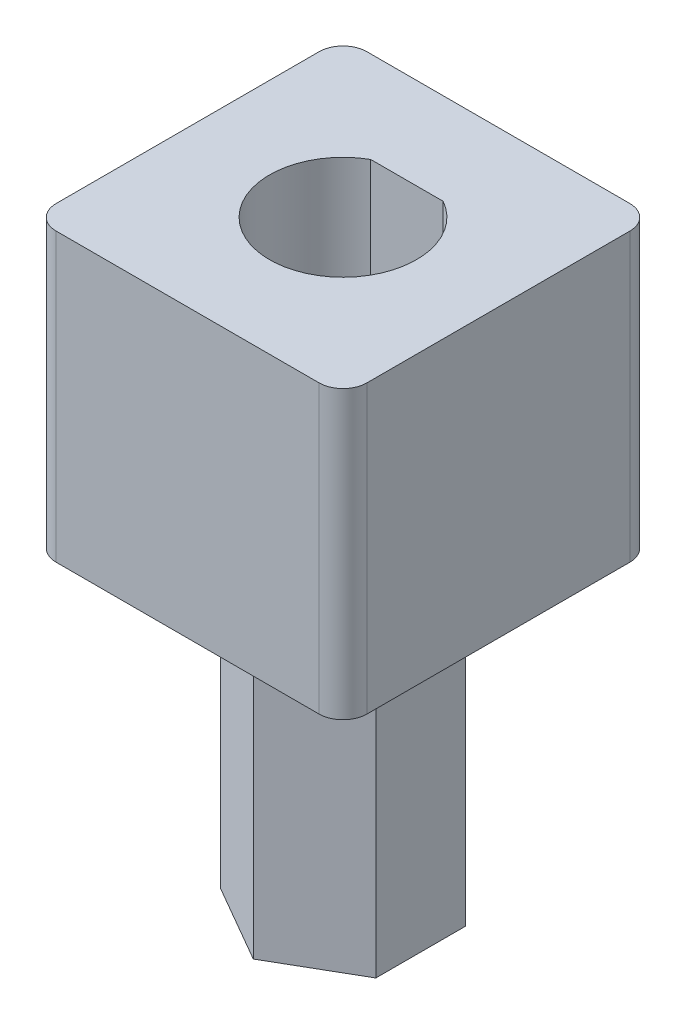
ISO-10303-21;
HEADER;
FILE_DESCRIPTION(('STEP AP214'),'2;1');
FILE_NAME('part.step','',(''),(''),'','','');
FILE_SCHEMA(('AUTOMOTIVE_DESIGN { 1 0 10303 214 1 1 1 1 }'));
ENDSEC;
DATA;
#1=APPLICATION_CONTEXT('core data for automotive mechanical design processes');
#2=APPLICATION_PROTOCOL_DEFINITION('international standard','automotive_design',2000,#1);
#3=PRODUCT_CONTEXT('',#1,'mechanical');
#4=PRODUCT('Part','Part','',(#3));
#5=PRODUCT_RELATED_PRODUCT_CATEGORY('part','',(#4));
#6=PRODUCT_DEFINITION_FORMATION('','',#4);
#7=PRODUCT_DEFINITION_CONTEXT('part definition',#1,'design');
#8=PRODUCT_DEFINITION('design','',#6,#7);
#9=PRODUCT_DEFINITION_SHAPE('','',#8);
#10=(LENGTH_UNIT() NAMED_UNIT(*) SI_UNIT(.MILLI.,.METRE.));
#11=(NAMED_UNIT(*) PLANE_ANGLE_UNIT() SI_UNIT($,.RADIAN.));
#12=(NAMED_UNIT(*) SI_UNIT($,.STERADIAN.) SOLID_ANGLE_UNIT());
#13=UNCERTAINTY_MEASURE_WITH_UNIT(LENGTH_MEASURE(1.E-05),#10,'distance_accuracy_value','');
#14=(GEOMETRIC_REPRESENTATION_CONTEXT(3) GLOBAL_UNCERTAINTY_ASSIGNED_CONTEXT((#13)) GLOBAL_UNIT_ASSIGNED_CONTEXT((#10,
#11,#12)) REPRESENTATION_CONTEXT('',''));
#15=CARTESIAN_POINT('',(0.,0.,0.));
#16=DIRECTION('',(0.,0.,1.));
#17=DIRECTION('',(1.,0.,0.));
#18=AXIS2_PLACEMENT_3D('',#15,#16,#17);
#19=CARTESIAN_POINT('',(0.,13.,0.));
#20=DIRECTION('',(0.,1.,0.));
#21=DIRECTION('',(0.,0.,1.));
#22=AXIS2_PLACEMENT_3D('',#19,#20,#21);
#23=PLANE('',#22);
#24=DIRECTION('',(-1.,0.,0.));
#25=VECTOR('',#24,1.);
#26=CARTESIAN_POINT('',(-1.51657508881031,13.,-2.675));
#27=LINE('',#26,#25);
#28=CARTESIAN_POINT('',(1.51657508881031,13.,-2.675));
#29=VERTEX_POINT('',#28);
#30=CARTESIAN_POINT('',(-1.51657508881031,13.,-2.675));
#31=VERTEX_POINT('',#30);
#32=EDGE_CURVE('E227',#29,#31,#27,.T.);
#33=ORIENTED_EDGE('',*,*,#32,.T.);
#34=CARTESIAN_POINT('',(0.,13.,0.));
#35=DIRECTION('',(0.,1.,0.));
#36=DIRECTION('',(0.,0.,1.));
#37=AXIS2_PLACEMENT_3D('',#34,#35,#36);
#38=CIRCLE('',#37,3.075);
#39=EDGE_CURVE('E315',#29,#31,#38,.F.);
#40=ORIENTED_EDGE('',*,*,#39,.F.);
#41=EDGE_LOOP('',(#33,#40));
#42=FACE_BOUND('',#41,.T.);
#43=ADVANCED_FACE('F41',(#42),#23,.T.);
#44=CARTESIAN_POINT('',(0.,13.,0.));
#45=DIRECTION('',(0.,1.,0.));
#46=DIRECTION('',(0.,0.,1.));
#47=AXIS2_PLACEMENT_3D('',#44,#45,#46);
#48=PLANE('',#47);
#49=CARTESIAN_POINT('',(0.,13.,0.));
#50=DIRECTION('',(0.,1.,0.));
#51=DIRECTION('',(0.,0.,1.));
#52=AXIS2_PLACEMENT_3D('',#49,#50,#51);
#53=CIRCLE('',#52,6.25277674973265);
#54=CARTESIAN_POINT('',(0.,13.,6.25277674973272));
#55=VERTEX_POINT('',#54);
#56=EDGE_CURVE('E11',#55,#55,#53,.F.);
#57=ORIENTED_EDGE('',*,*,#56,.F.);
#58=EDGE_LOOP('',(#57));
#59=FACE_BOUND('',#58,.T.);
#60=DIRECTION('',(-1.,0.,0.));
#61=VECTOR('',#60,1.);
#62=CARTESIAN_POINT('',(-6.5,13.,-6.5));
#63=LINE('',#62,#61);
#64=CARTESIAN_POINT('',(5.5,13.,-6.5));
#65=VERTEX_POINT('',#64);
#66=CARTESIAN_POINT('',(-5.5,13.,-6.5));
#67=VERTEX_POINT('',#66);
#68=EDGE_CURVE('E251',#65,#67,#63,.T.);
#69=ORIENTED_EDGE('',*,*,#68,.F.);
#70=CARTESIAN_POINT('',(5.5,13.,-5.5));
#71=DIRECTION('',(0.,1.,0.));
#72=DIRECTION('',(0.,0.,1.));
#73=AXIS2_PLACEMENT_3D('',#70,#71,#72);
#74=CIRCLE('',#73,1.);
#75=CARTESIAN_POINT('',(6.5,13.,-5.5));
#76=VERTEX_POINT('',#75);
#77=EDGE_CURVE('E335',#65,#76,#74,.F.);
#78=ORIENTED_EDGE('',*,*,#77,.T.);
#79=DIRECTION('',(0.,0.,-1.));
#80=VECTOR('',#79,1.);
#81=CARTESIAN_POINT('',(6.5,13.,-6.5));
#82=LINE('',#81,#80);
#83=CARTESIAN_POINT('',(6.5,13.,5.5));
#84=VERTEX_POINT('',#83);
#85=EDGE_CURVE('E271',#84,#76,#82,.T.);
#86=ORIENTED_EDGE('',*,*,#85,.F.);
#87=CARTESIAN_POINT('',(5.5,13.,5.5));
#88=DIRECTION('',(0.,1.,0.));
#89=DIRECTION('',(0.,0.,1.));
#90=AXIS2_PLACEMENT_3D('',#87,#88,#89);
#91=CIRCLE('',#90,1.);
#92=CARTESIAN_POINT('',(5.5,13.,6.5));
#93=VERTEX_POINT('',#92);
#94=EDGE_CURVE('E329',#84,#93,#91,.F.);
#95=ORIENTED_EDGE('',*,*,#94,.T.);
#96=DIRECTION('',(1.,0.,0.));
#97=VECTOR('',#96,1.);
#98=CARTESIAN_POINT('',(-6.5,13.,6.5));
#99=LINE('',#98,#97);
#100=CARTESIAN_POINT('',(-5.5,13.,6.5));
#101=VERTEX_POINT('',#100);
#102=EDGE_CURVE('E267',#101,#93,#99,.T.);
#103=ORIENTED_EDGE('',*,*,#102,.F.);
#104=CARTESIAN_POINT('',(-5.5,13.,5.5));
#105=DIRECTION('',(0.,1.,0.));
#106=DIRECTION('',(0.,0.,1.));
#107=AXIS2_PLACEMENT_3D('',#104,#105,#106);
#108=CIRCLE('',#107,1.);
#109=CARTESIAN_POINT('',(-6.5,13.,5.5));
#110=VERTEX_POINT('',#109);
#111=EDGE_CURVE('E326',#101,#110,#108,.F.);
#112=ORIENTED_EDGE('',*,*,#111,.T.);
#113=DIRECTION('',(0.,0.,1.));
#114=VECTOR('',#113,1.);
#115=CARTESIAN_POINT('',(-6.5,13.,-6.5));
#116=LINE('',#115,#114);
#117=CARTESIAN_POINT('',(-6.5,13.,-5.5));
#118=VERTEX_POINT('',#117);
#119=EDGE_CURVE('E245',#118,#110,#116,.T.);
#120=ORIENTED_EDGE('',*,*,#119,.F.);
#121=CARTESIAN_POINT('',(-5.5,13.,-5.5));
#122=DIRECTION('',(0.,1.,0.));
#123=DIRECTION('',(0.,0.,1.));
#124=AXIS2_PLACEMENT_3D('',#121,#122,#123);
#125=CIRCLE('',#124,1.);
#126=EDGE_CURVE('E332',#118,#67,#125,.F.);
#127=ORIENTED_EDGE('',*,*,#126,.T.);
#128=EDGE_LOOP('',(#69,#78,#86,#95,#103,#112,#120,#127));
#129=FACE_BOUND('',#128,.T.);
#130=ADVANCED_FACE('F390',(#59,#129),#48,.F.);
#131=CARTESIAN_POINT('',(0.,25.,0.));
#132=DIRECTION('',(0.,1.,0.));
#133=DIRECTION('',(0.,0.,1.));
#134=AXIS2_PLACEMENT_3D('',#131,#132,#133);
#135=PLANE('',#134);
#136=DIRECTION('',(0.,0.,-1.));
#137=VECTOR('',#136,1.);
#138=CARTESIAN_POINT('',(6.5,25.,-6.5));
#139=LINE('',#138,#137);
#140=CARTESIAN_POINT('',(6.5,25.,5.5));
#141=VERTEX_POINT('',#140);
#142=CARTESIAN_POINT('',(6.5,25.,-5.5));
#143=VERTEX_POINT('',#142);
#144=EDGE_CURVE('E255',#141,#143,#139,.T.);
#145=ORIENTED_EDGE('',*,*,#144,.T.);
#146=CARTESIAN_POINT('',(5.5,25.,-5.5));
#147=DIRECTION('',(0.,1.,0.));
#148=DIRECTION('',(0.,0.,1.));
#149=AXIS2_PLACEMENT_3D('',#146,#147,#148);
#150=CIRCLE('',#149,1.);
#151=CARTESIAN_POINT('',(5.5,25.,-6.5));
#152=VERTEX_POINT('',#151);
#153=EDGE_CURVE('E354',#143,#152,#150,.T.);
#154=ORIENTED_EDGE('',*,*,#153,.T.);
#155=DIRECTION('',(-1.,0.,0.));
#156=VECTOR('',#155,1.);
#157=CARTESIAN_POINT('',(-6.5,25.,-6.5));
#158=LINE('',#157,#156);
#159=CARTESIAN_POINT('',(-5.5,25.,-6.5));
#160=VERTEX_POINT('',#159);
#161=EDGE_CURVE('E259',#152,#160,#158,.T.);
#162=ORIENTED_EDGE('',*,*,#161,.T.);
#163=CARTESIAN_POINT('',(-5.5,25.,-5.5));
#164=DIRECTION('',(0.,1.,0.));
#165=DIRECTION('',(0.,0.,1.));
#166=AXIS2_PLACEMENT_3D('',#163,#164,#165);
#167=CIRCLE('',#166,1.);
#168=CARTESIAN_POINT('',(-6.5,25.,-5.5));
#169=VERTEX_POINT('',#168);
#170=EDGE_CURVE('E351',#160,#169,#167,.T.);
#171=ORIENTED_EDGE('',*,*,#170,.T.);
#172=DIRECTION('',(0.,0.,1.));
#173=VECTOR('',#172,1.);
#174=CARTESIAN_POINT('',(-6.5,25.,-6.5));
#175=LINE('',#174,#173);
#176=CARTESIAN_POINT('',(-6.5,25.,5.5));
#177=VERTEX_POINT('',#176);
#178=EDGE_CURVE('E246',#169,#177,#175,.T.);
#179=ORIENTED_EDGE('',*,*,#178,.T.);
#180=CARTESIAN_POINT('',(-5.5,25.,5.5));
#181=DIRECTION('',(0.,1.,0.));
#182=DIRECTION('',(0.,0.,1.));
#183=AXIS2_PLACEMENT_3D('',#180,#181,#182);
#184=CIRCLE('',#183,1.);
#185=CARTESIAN_POINT('',(-5.5,25.,6.5));
#186=VERTEX_POINT('',#185);
#187=EDGE_CURVE('E345',#177,#186,#184,.T.);
#188=ORIENTED_EDGE('',*,*,#187,.T.);
#189=DIRECTION('',(1.,0.,0.));
#190=VECTOR('',#189,1.);
#191=CARTESIAN_POINT('',(-6.5,25.,6.5));
#192=LINE('',#191,#190);
#193=CARTESIAN_POINT('',(5.5,25.,6.5));
#194=VERTEX_POINT('',#193);
#195=EDGE_CURVE('E250',#186,#194,#192,.T.);
#196=ORIENTED_EDGE('',*,*,#195,.T.);
#197=CARTESIAN_POINT('',(5.5,25.,5.5));
#198=DIRECTION('',(0.,1.,0.));
#199=DIRECTION('',(0.,0.,1.));
#200=AXIS2_PLACEMENT_3D('',#197,#198,#199);
#201=CIRCLE('',#200,1.);
#202=EDGE_CURVE('E348',#194,#141,#201,.T.);
#203=ORIENTED_EDGE('',*,*,#202,.T.);
#204=EDGE_LOOP('',(#145,#154,#162,#171,#179,#188,#196,#203));
#205=FACE_BOUND('',#204,.T.);
#206=CARTESIAN_POINT('',(0.,25.,0.));
#207=DIRECTION('',(0.,1.,0.));
#208=DIRECTION('',(0.,0.,1.));
#209=AXIS2_PLACEMENT_3D('',#206,#207,#208);
#210=CIRCLE('',#209,3.075);
#211=CARTESIAN_POINT('',(-1.51657508881031,25.,-2.675));
#212=VERTEX_POINT('',#211);
#213=CARTESIAN_POINT('',(1.51657508881031,25.,-2.675));
#214=VERTEX_POINT('',#213);
#215=EDGE_CURVE('E232',#212,#214,#210,.T.);
#216=ORIENTED_EDGE('',*,*,#215,.F.);
#217=DIRECTION('',(1.,0.,0.));
#218=VECTOR('',#217,1.);
#219=CARTESIAN_POINT('',(-1.51657508881031,25.,-2.675));
#220=LINE('',#219,#218);
#221=EDGE_CURVE('E228',#212,#214,#220,.T.);
#222=ORIENTED_EDGE('',*,*,#221,.T.);
#223=EDGE_LOOP('',(#216,#222));
#224=FACE_BOUND('',#223,.T.);
#225=ADVANCED_FACE('F378',(#205,#224),#135,.T.);
#226=CARTESIAN_POINT('',(-6.5,25.,-6.5));
#227=DIRECTION('',(1.,0.,0.));
#228=DIRECTION('',(0.,0.,-1.));
#229=AXIS2_PLACEMENT_3D('',#226,#227,#228);
#230=PLANE('',#229);
#231=ORIENTED_EDGE('',*,*,#178,.F.);
#232=DIRECTION('',(0.,-1.,0.));
#233=VECTOR('',#232,1.);
#234=CARTESIAN_POINT('',(-6.5,25.,-5.5));
#235=LINE('',#234,#233);
#236=EDGE_CURVE('E360',#169,#118,#235,.T.);
#237=ORIENTED_EDGE('',*,*,#236,.T.);
#238=ORIENTED_EDGE('',*,*,#119,.T.);
#239=DIRECTION('',(0.,-1.,0.));
#240=VECTOR('',#239,1.);
#241=CARTESIAN_POINT('',(-6.5,25.,5.5));
#242=LINE('',#241,#240);
#243=EDGE_CURVE('E357',#110,#177,#242,.F.);
#244=ORIENTED_EDGE('',*,*,#243,.T.);
#245=EDGE_LOOP('',(#231,#237,#238,#244));
#246=FACE_BOUND('',#245,.T.);
#247=ADVANCED_FACE('F406',(#246),#230,.F.);
#248=CARTESIAN_POINT('',(-6.5,25.,6.5));
#249=DIRECTION('',(0.,0.,-1.));
#250=DIRECTION('',(-1.,0.,0.));
#251=AXIS2_PLACEMENT_3D('',#248,#249,#250);
#252=PLANE('',#251);
#253=ORIENTED_EDGE('',*,*,#102,.T.);
#254=DIRECTION('',(0.,-1.,0.));
#255=VECTOR('',#254,1.);
#256=CARTESIAN_POINT('',(5.5,25.,6.5));
#257=LINE('',#256,#255);
#258=EDGE_CURVE('E51',#93,#194,#257,.F.);
#259=ORIENTED_EDGE('',*,*,#258,.T.);
#260=ORIENTED_EDGE('',*,*,#195,.F.);
#261=DIRECTION('',(0.,-1.,0.));
#262=VECTOR('',#261,1.);
#263=CARTESIAN_POINT('',(-5.5,25.,6.5));
#264=LINE('',#263,#262);
#265=EDGE_CURVE('E364',#186,#101,#264,.T.);
#266=ORIENTED_EDGE('',*,*,#265,.T.);
#267=EDGE_LOOP('',(#253,#259,#260,#266));
#268=FACE_BOUND('',#267,.T.);
#269=ADVANCED_FACE('F372',(#268),#252,.F.);
#270=CARTESIAN_POINT('',(6.5,25.,-6.5));
#271=DIRECTION('',(-1.,0.,0.));
#272=DIRECTION('',(0.,0.,1.));
#273=AXIS2_PLACEMENT_3D('',#270,#271,#272);
#274=PLANE('',#273);
#275=ORIENTED_EDGE('',*,*,#85,.T.);
#276=DIRECTION('',(0.,-1.,0.));
#277=VECTOR('',#276,1.);
#278=CARTESIAN_POINT('',(6.5,25.,-5.5));
#279=LINE('',#278,#277);
#280=EDGE_CURVE('E342',#76,#143,#279,.F.);
#281=ORIENTED_EDGE('',*,*,#280,.T.);
#282=ORIENTED_EDGE('',*,*,#144,.F.);
#283=DIRECTION('',(0.,-1.,0.));
#284=VECTOR('',#283,1.);
#285=CARTESIAN_POINT('',(6.5,25.,5.5));
#286=LINE('',#285,#284);
#287=EDGE_CURVE('E338',#141,#84,#286,.T.);
#288=ORIENTED_EDGE('',*,*,#287,.T.);
#289=EDGE_LOOP('',(#275,#281,#282,#288));
#290=FACE_BOUND('',#289,.T.);
#291=ADVANCED_FACE('F386',(#290),#274,.F.);
#292=CARTESIAN_POINT('',(-6.5,25.,-6.5));
#293=DIRECTION('',(0.,0.,1.));
#294=DIRECTION('',(1.,0.,0.));
#295=AXIS2_PLACEMENT_3D('',#292,#293,#294);
#296=PLANE('',#295);
#297=CARTESIAN_POINT('',(0.,20.,-6.5));
#298=DIRECTION('',(0.,0.,1.));
#299=DIRECTION('',(1.,0.,0.));
#300=AXIS2_PLACEMENT_3D('',#297,#298,#299);
#301=CIRCLE('',#300,1.425);
#302=CARTESIAN_POINT('',(1.425,20.,-6.5));
#303=VERTEX_POINT('',#302);
#304=EDGE_CURVE('E223',#303,#303,#301,.T.);
#305=ORIENTED_EDGE('',*,*,#304,.T.);
#306=EDGE_LOOP('',(#305));
#307=FACE_BOUND('',#306,.T.);
#308=ORIENTED_EDGE('',*,*,#161,.F.);
#309=DIRECTION('',(0.,-1.,0.));
#310=VECTOR('',#309,1.);
#311=CARTESIAN_POINT('',(5.5,25.,-6.5));
#312=LINE('',#311,#310);
#313=EDGE_CURVE('E322',#152,#65,#312,.T.);
#314=ORIENTED_EDGE('',*,*,#313,.T.);
#315=ORIENTED_EDGE('',*,*,#68,.T.);
#316=DIRECTION('',(0.,-1.,0.));
#317=VECTOR('',#316,1.);
#318=CARTESIAN_POINT('',(-5.5,25.,-6.5));
#319=LINE('',#318,#317);
#320=EDGE_CURVE('E319',#67,#160,#319,.F.);
#321=ORIENTED_EDGE('',*,*,#320,.T.);
#322=EDGE_LOOP('',(#308,#314,#315,#321));
#323=FACE_BOUND('',#322,.T.);
#324=ADVANCED_FACE('F397',(#307,#323),#296,.F.);
#325=CARTESIAN_POINT('',(0.,25.,0.));
#326=DIRECTION('',(0.,-1.,0.));
#327=DIRECTION('',(0.,0.,-1.));
#328=AXIS2_PLACEMENT_3D('',#325,#326,#327);
#329=CYLINDRICAL_SURFACE('',#328,3.075);
#330=DIRECTION('',(0.,1.,0.));
#331=VECTOR('',#330,1.);
#332=CARTESIAN_POINT('',(-1.51657508881031,-0.00199999999999853,-2.675));
#333=LINE('',#332,#331);
#334=EDGE_CURVE('E234',#31,#212,#333,.T.);
#335=ORIENTED_EDGE('',*,*,#334,.T.);
#336=ORIENTED_EDGE('',*,*,#215,.T.);
#337=DIRECTION('',(0.,1.,0.));
#338=VECTOR('',#337,1.);
#339=CARTESIAN_POINT('',(1.51657508881031,-0.00199999999999853,-2.675));
#340=LINE('',#339,#338);
#341=EDGE_CURVE('E233',#29,#214,#340,.T.);
#342=ORIENTED_EDGE('',*,*,#341,.F.);
#343=ORIENTED_EDGE('',*,*,#39,.T.);
#344=EDGE_LOOP('',(#335,#336,#342,#343));
#345=FACE_BOUND('',#344,.T.);
#346=ADVANCED_FACE('F601',(#345),#329,.F.);
#347=CARTESIAN_POINT('',(-1.51657508881031,-0.00199999999999853,-2.675));
#348=DIRECTION('',(0.,0.,1.));
#349=DIRECTION('',(1.,0.,0.));
#350=AXIS2_PLACEMENT_3D('',#347,#348,#349);
#351=PLANE('',#350);
#352=CARTESIAN_POINT('',(0.,20.,-2.675));
#353=DIRECTION('',(0.,0.,1.));
#354=DIRECTION('',(1.,0.,0.));
#355=AXIS2_PLACEMENT_3D('',#352,#353,#354);
#356=CIRCLE('',#355,1.425);
#357=CARTESIAN_POINT('',(1.425,20.,-2.675));
#358=VERTEX_POINT('',#357);
#359=EDGE_CURVE('E178',#358,#358,#356,.T.);
#360=ORIENTED_EDGE('',*,*,#359,.F.);
#361=EDGE_LOOP('',(#360));
#362=FACE_BOUND('',#361,.T.);
#363=ORIENTED_EDGE('',*,*,#32,.F.);
#364=ORIENTED_EDGE('',*,*,#341,.T.);
#365=ORIENTED_EDGE('',*,*,#221,.F.);
#366=ORIENTED_EDGE('',*,*,#334,.F.);
#367=EDGE_LOOP('',(#363,#364,#365,#366));
#368=FACE_BOUND('',#367,.T.);
#369=ADVANCED_FACE('F597',(#362,#368),#351,.T.);
#370=CARTESIAN_POINT('',(0.,20.,-14.675));
#371=DIRECTION('',(0.,0.,1.));
#372=DIRECTION('',(1.,0.,0.));
#373=AXIS2_PLACEMENT_3D('',#370,#371,#372);
#374=CYLINDRICAL_SURFACE('',#373,1.425);
#375=ORIENTED_EDGE('',*,*,#359,.T.);
#376=EDGE_LOOP('',(#375));
#377=FACE_BOUND('',#376,.T.);
#378=ORIENTED_EDGE('',*,*,#304,.F.);
#379=EDGE_LOOP('',(#378));
#380=FACE_BOUND('',#379,.T.);
#381=ADVANCED_FACE('F451',(#377,#380),#374,.F.);
#382=CARTESIAN_POINT('',(5.5,25.,-5.5));
#383=DIRECTION('',(0.,-1.,0.));
#384=DIRECTION('',(0.,0.,-1.));
#385=AXIS2_PLACEMENT_3D('',#382,#383,#384);
#386=CYLINDRICAL_SURFACE('',#385,1.);
#387=ORIENTED_EDGE('',*,*,#153,.F.);
#388=ORIENTED_EDGE('',*,*,#280,.F.);
#389=ORIENTED_EDGE('',*,*,#77,.F.);
#390=ORIENTED_EDGE('',*,*,#313,.F.);
#391=EDGE_LOOP('',(#387,#388,#389,#390));
#392=FACE_BOUND('',#391,.T.);
#393=ADVANCED_FACE('F394',(#392),#386,.T.);
#394=CARTESIAN_POINT('',(-5.5,25.,-5.5));
#395=DIRECTION('',(0.,-1.,0.));
#396=DIRECTION('',(0.,0.,-1.));
#397=AXIS2_PLACEMENT_3D('',#394,#395,#396);
#398=CYLINDRICAL_SURFACE('',#397,1.);
#399=ORIENTED_EDGE('',*,*,#170,.F.);
#400=ORIENTED_EDGE('',*,*,#320,.F.);
#401=ORIENTED_EDGE('',*,*,#126,.F.);
#402=ORIENTED_EDGE('',*,*,#236,.F.);
#403=EDGE_LOOP('',(#399,#400,#401,#402));
#404=FACE_BOUND('',#403,.T.);
#405=ADVANCED_FACE('F403',(#404),#398,.T.);
#406=CARTESIAN_POINT('',(5.5,25.,5.5));
#407=DIRECTION('',(0.,-1.,0.));
#408=DIRECTION('',(0.,0.,-1.));
#409=AXIS2_PLACEMENT_3D('',#406,#407,#408);
#410=CYLINDRICAL_SURFACE('',#409,1.);
#411=ORIENTED_EDGE('',*,*,#202,.F.);
#412=ORIENTED_EDGE('',*,*,#258,.F.);
#413=ORIENTED_EDGE('',*,*,#94,.F.);
#414=ORIENTED_EDGE('',*,*,#287,.F.);
#415=EDGE_LOOP('',(#411,#412,#413,#414));
#416=FACE_BOUND('',#415,.T.);
#417=ADVANCED_FACE('F383',(#416),#410,.T.);
#418=CARTESIAN_POINT('',(-5.5,25.,5.5));
#419=DIRECTION('',(0.,-1.,0.));
#420=DIRECTION('',(0.,0.,-1.));
#421=AXIS2_PLACEMENT_3D('',#418,#419,#420);
#422=CYLINDRICAL_SURFACE('',#421,1.);
#423=ORIENTED_EDGE('',*,*,#187,.F.);
#424=ORIENTED_EDGE('',*,*,#243,.F.);
#425=ORIENTED_EDGE('',*,*,#111,.F.);
#426=ORIENTED_EDGE('',*,*,#265,.F.);
#427=EDGE_LOOP('',(#423,#424,#425,#426));
#428=FACE_BOUND('',#427,.T.);
#429=ADVANCED_FACE('F43',(#428),#422,.T.);
#430=CARTESIAN_POINT('',(0.,12.9999999999999,0.));
#431=DIRECTION('',(0.,1.,0.));
#432=DIRECTION('',(0.,0.,1.));
#433=AXIS2_PLACEMENT_3D('',#430,#431,#432);
#434=CONICAL_SURFACE('',#433,6.25277674973252,0.896055384571342);
#435=CARTESIAN_POINT('',(0.,10.9999999999999,0.));
#436=DIRECTION('',(0.,-1.,0.));
#437=DIRECTION('',(0.,0.,-1.));
#438=AXIS2_PLACEMENT_3D('',#435,#436,#437);
#439=CIRCLE('',#438,3.75277674973253);
#440=CARTESIAN_POINT('',(0.,11.,-3.75277674973257));
#441=VERTEX_POINT('',#440);
#442=CARTESIAN_POINT('',(3.25,11.,-1.87638837486628));
#443=VERTEX_POINT('',#442);
#444=EDGE_CURVE('E205',#441,#443,#439,.T.);
#445=ORIENTED_EDGE('',*,*,#444,.F.);
#446=CARTESIAN_POINT('',(-3.25,11.,-1.87638837486628));
#447=VERTEX_POINT('',#446);
#448=EDGE_CURVE('E197',#447,#441,#439,.T.);
#449=ORIENTED_EDGE('',*,*,#448,.F.);
#450=CARTESIAN_POINT('',(-3.25,10.9999999999999,1.87638837486625));
#451=VERTEX_POINT('',#450);
#452=EDGE_CURVE('E184',#451,#447,#439,.T.);
#453=ORIENTED_EDGE('',*,*,#452,.F.);
#454=CARTESIAN_POINT('',(0.,11.,3.75277674973257));
#455=VERTEX_POINT('',#454);
#456=EDGE_CURVE('E194',#455,#451,#439,.T.);
#457=ORIENTED_EDGE('',*,*,#456,.F.);
#458=CARTESIAN_POINT('',(3.25,11.,1.87638837486628));
#459=VERTEX_POINT('',#458);
#460=EDGE_CURVE('E202',#459,#455,#439,.T.);
#461=ORIENTED_EDGE('',*,*,#460,.F.);
#462=EDGE_CURVE('E204',#443,#459,#439,.T.);
#463=ORIENTED_EDGE('',*,*,#462,.F.);
#464=EDGE_LOOP('',(#445,#449,#453,#457,#461,#463));
#465=FACE_BOUND('',#464,.T.);
#466=ORIENTED_EDGE('',*,*,#56,.T.);
#467=EDGE_LOOP('',(#466));
#468=FACE_BOUND('',#467,.T.);
#469=ADVANCED_FACE('F191',(#465,#468),#434,.T.);
#470=CARTESIAN_POINT('',(0.,11.,3.75277674973257));
#471=DIRECTION('',(0.,1.,0.));
#472=DIRECTION('',(0.,0.,1.));
#473=AXIS2_PLACEMENT_3D('',#470,#471,#472);
#474=PLANE('',#473);
#475=ORIENTED_EDGE('',*,*,#452,.T.);
#476=DIRECTION('',(0.,0.,1.));
#477=VECTOR('',#476,1.);
#478=CARTESIAN_POINT('',(-3.25,11.,-1.87638837486629));
#479=LINE('',#478,#477);
#480=EDGE_CURVE('E160',#447,#451,#479,.T.);
#481=ORIENTED_EDGE('',*,*,#480,.T.);
#482=EDGE_LOOP('',(#475,#481));
#483=FACE_BOUND('',#482,.T.);
#484=ADVANCED_FACE('F183',(#483),#474,.F.);
#485=ORIENTED_EDGE('',*,*,#448,.T.);
#486=DIRECTION('',(-0.866025403784439,0.,0.5));
#487=VECTOR('',#486,1.);
#488=CARTESIAN_POINT('',(0.,11.,-3.75277674973257));
#489=LINE('',#488,#487);
#490=EDGE_CURVE('E186',#441,#447,#489,.T.);
#491=ORIENTED_EDGE('',*,*,#490,.T.);
#492=EDGE_LOOP('',(#485,#491));
#493=FACE_BOUND('',#492,.T.);
#494=ADVANCED_FACE('F496',(#493),#474,.F.);
#495=ORIENTED_EDGE('',*,*,#444,.T.);
#496=DIRECTION('',(-0.866025403784439,0.,-0.5));
#497=VECTOR('',#496,1.);
#498=CARTESIAN_POINT('',(3.25,11.,-1.87638837486629));
#499=LINE('',#498,#497);
#500=EDGE_CURVE('E212',#443,#441,#499,.T.);
#501=ORIENTED_EDGE('',*,*,#500,.T.);
#502=EDGE_LOOP('',(#495,#501));
#503=FACE_BOUND('',#502,.T.);
#504=ADVANCED_FACE('F506',(#503),#474,.F.);
#505=ORIENTED_EDGE('',*,*,#462,.T.);
#506=DIRECTION('',(0.,0.,-1.));
#507=VECTOR('',#506,1.);
#508=CARTESIAN_POINT('',(3.25,11.,1.87638837486628));
#509=LINE('',#508,#507);
#510=EDGE_CURVE('E66',#459,#443,#509,.T.);
#511=ORIENTED_EDGE('',*,*,#510,.T.);
#512=EDGE_LOOP('',(#505,#511));
#513=FACE_BOUND('',#512,.T.);
#514=ADVANCED_FACE('F515',(#513),#474,.F.);
#515=ORIENTED_EDGE('',*,*,#460,.T.);
#516=DIRECTION('',(0.866025403784439,0.,-0.5));
#517=VECTOR('',#516,1.);
#518=CARTESIAN_POINT('',(0.,11.,3.75277674973257));
#519=LINE('',#518,#517);
#520=EDGE_CURVE('E58',#455,#459,#519,.T.);
#521=ORIENTED_EDGE('',*,*,#520,.T.);
#522=EDGE_LOOP('',(#515,#521));
#523=FACE_BOUND('',#522,.T.);
#524=ADVANCED_FACE('F524',(#523),#474,.F.);
#525=ORIENTED_EDGE('',*,*,#456,.T.);
#526=DIRECTION('',(0.866025403784439,0.,0.5));
#527=VECTOR('',#526,1.);
#528=CARTESIAN_POINT('',(-3.25,11.,1.87638837486628));
#529=LINE('',#528,#527);
#530=EDGE_CURVE('E171',#451,#455,#529,.T.);
#531=ORIENTED_EDGE('',*,*,#530,.T.);
#532=EDGE_LOOP('',(#525,#531));
#533=FACE_BOUND('',#532,.T.);
#534=ADVANCED_FACE('F200',(#533),#474,.F.);
#535=CARTESIAN_POINT('',(-3.25,13.,-1.87638837486628));
#536=DIRECTION('',(1.,0.,0.));
#537=DIRECTION('',(0.,0.,-1.));
#538=AXIS2_PLACEMENT_3D('',#535,#536,#537);
#539=PLANE('',#538);
#540=ORIENTED_EDGE('',*,*,#480,.F.);
#541=DIRECTION('',(0.,-1.,0.));
#542=VECTOR('',#541,1.);
#543=CARTESIAN_POINT('',(-3.25,13.,-1.87638837486628));
#544=LINE('',#543,#542);
#545=CARTESIAN_POINT('',(-3.25,0.,-1.87638837486628));
#546=VERTEX_POINT('',#545);
#547=EDGE_CURVE('E168',#447,#546,#544,.T.);
#548=ORIENTED_EDGE('',*,*,#547,.T.);
#549=DIRECTION('',(0.,0.,1.));
#550=VECTOR('',#549,1.);
#551=CARTESIAN_POINT('',(-3.25,0.,-1.87638837486628));
#552=LINE('',#551,#550);
#553=CARTESIAN_POINT('',(-3.25,0.,1.87638837486628));
#554=VERTEX_POINT('',#553);
#555=EDGE_CURVE('E163',#546,#554,#552,.T.);
#556=ORIENTED_EDGE('',*,*,#555,.T.);
#557=DIRECTION('',(0.,-1.,0.));
#558=VECTOR('',#557,1.);
#559=CARTESIAN_POINT('',(-3.25,13.,1.87638837486628));
#560=LINE('',#559,#558);
#561=EDGE_CURVE('E156',#451,#554,#560,.T.);
#562=ORIENTED_EDGE('',*,*,#561,.F.);
#563=EDGE_LOOP('',(#540,#548,#556,#562));
#564=FACE_BOUND('',#563,.T.);
#565=ADVANCED_FACE('F158',(#564),#539,.F.);
#566=CARTESIAN_POINT('',(0.,13.,-3.75277674973257));
#567=DIRECTION('',(0.5,0.,0.866025403784439));
#568=DIRECTION('',(0.866025403784439,0.,-0.5));
#569=AXIS2_PLACEMENT_3D('',#566,#567,#568);
#570=PLANE('',#569);
#571=ORIENTED_EDGE('',*,*,#490,.F.);
#572=DIRECTION('',(0.,-1.,0.));
#573=VECTOR('',#572,1.);
#574=CARTESIAN_POINT('',(0.,13.,-3.75277674973257));
#575=LINE('',#574,#573);
#576=CARTESIAN_POINT('',(0.,0.,-3.75277674973257));
#577=VERTEX_POINT('',#576);
#578=EDGE_CURVE('E304',#441,#577,#575,.T.);
#579=ORIENTED_EDGE('',*,*,#578,.T.);
#580=DIRECTION('',(-0.866025403784439,0.,0.5));
#581=VECTOR('',#580,1.);
#582=CARTESIAN_POINT('',(0.,0.,-3.75277674973257));
#583=LINE('',#582,#581);
#584=EDGE_CURVE('E296',#577,#546,#583,.T.);
#585=ORIENTED_EDGE('',*,*,#584,.T.);
#586=ORIENTED_EDGE('',*,*,#547,.F.);
#587=EDGE_LOOP('',(#571,#579,#585,#586));
#588=FACE_BOUND('',#587,.T.);
#589=ADVANCED_FACE('F433',(#588),#570,.F.);
#590=CARTESIAN_POINT('',(3.25,13.,-1.87638837486628));
#591=DIRECTION('',(-0.5,0.,0.866025403784439));
#592=DIRECTION('',(0.866025403784439,0.,0.5));
#593=AXIS2_PLACEMENT_3D('',#590,#591,#592);
#594=PLANE('',#593);
#595=ORIENTED_EDGE('',*,*,#500,.F.);
#596=DIRECTION('',(0.,-1.,0.));
#597=VECTOR('',#596,1.);
#598=CARTESIAN_POINT('',(3.25,13.,-1.87638837486628));
#599=LINE('',#598,#597);
#600=CARTESIAN_POINT('',(3.25,0.,-1.87638837486628));
#601=VERTEX_POINT('',#600);
#602=EDGE_CURVE('E307',#443,#601,#599,.T.);
#603=ORIENTED_EDGE('',*,*,#602,.T.);
#604=DIRECTION('',(-0.866025403784439,0.,-0.5));
#605=VECTOR('',#604,1.);
#606=CARTESIAN_POINT('',(3.25,0.,-1.87638837486628));
#607=LINE('',#606,#605);
#608=EDGE_CURVE('E292',#601,#577,#607,.T.);
#609=ORIENTED_EDGE('',*,*,#608,.T.);
#610=ORIENTED_EDGE('',*,*,#578,.F.);
#611=EDGE_LOOP('',(#595,#603,#609,#610));
#612=FACE_BOUND('',#611,.T.);
#613=ADVANCED_FACE('F436',(#612),#594,.F.);
#614=CARTESIAN_POINT('',(3.25,13.,1.87638837486628));
#615=DIRECTION('',(-1.,0.,0.));
#616=DIRECTION('',(0.,0.,1.));
#617=AXIS2_PLACEMENT_3D('',#614,#615,#616);
#618=PLANE('',#617);
#619=ORIENTED_EDGE('',*,*,#510,.F.);
#620=DIRECTION('',(0.,-1.,0.));
#621=VECTOR('',#620,1.);
#622=CARTESIAN_POINT('',(3.25,13.,1.87638837486628));
#623=LINE('',#622,#621);
#624=CARTESIAN_POINT('',(3.25,0.,1.87638837486628));
#625=VERTEX_POINT('',#624);
#626=EDGE_CURVE('E310',#459,#625,#623,.T.);
#627=ORIENTED_EDGE('',*,*,#626,.T.);
#628=DIRECTION('',(0.,0.,-1.));
#629=VECTOR('',#628,1.);
#630=CARTESIAN_POINT('',(3.25,0.,1.87638837486628));
#631=LINE('',#630,#629);
#632=EDGE_CURVE('E288',#625,#601,#631,.T.);
#633=ORIENTED_EDGE('',*,*,#632,.T.);
#634=ORIENTED_EDGE('',*,*,#602,.F.);
#635=EDGE_LOOP('',(#619,#627,#633,#634));
#636=FACE_BOUND('',#635,.T.);
#637=ADVANCED_FACE('F440',(#636),#618,.F.);
#638=CARTESIAN_POINT('',(0.,13.,3.75277674973257));
#639=DIRECTION('',(-0.5,0.,-0.866025403784439));
#640=DIRECTION('',(-0.866025403784439,0.,0.5));
#641=AXIS2_PLACEMENT_3D('',#638,#639,#640);
#642=PLANE('',#641);
#643=ORIENTED_EDGE('',*,*,#520,.F.);
#644=DIRECTION('',(0.,-1.,0.));
#645=VECTOR('',#644,1.);
#646=CARTESIAN_POINT('',(0.,13.,3.75277674973257));
#647=LINE('',#646,#645);
#648=CARTESIAN_POINT('',(0.,0.,3.75277674973257));
#649=VERTEX_POINT('',#648);
#650=EDGE_CURVE('E173',#455,#649,#647,.T.);
#651=ORIENTED_EDGE('',*,*,#650,.T.);
#652=DIRECTION('',(0.866025403784439,0.,-0.5));
#653=VECTOR('',#652,1.);
#654=CARTESIAN_POINT('',(0.,0.,3.75277674973257));
#655=LINE('',#654,#653);
#656=EDGE_CURVE('E284',#649,#625,#655,.T.);
#657=ORIENTED_EDGE('',*,*,#656,.T.);
#658=ORIENTED_EDGE('',*,*,#626,.F.);
#659=EDGE_LOOP('',(#643,#651,#657,#658));
#660=FACE_BOUND('',#659,.T.);
#661=ADVANCED_FACE('F444',(#660),#642,.F.);
#662=CARTESIAN_POINT('',(-3.25,13.,1.87638837486628));
#663=DIRECTION('',(0.5,0.,-0.866025403784439));
#664=DIRECTION('',(-0.866025403784439,0.,-0.5));
#665=AXIS2_PLACEMENT_3D('',#662,#663,#664);
#666=PLANE('',#665);
#667=ORIENTED_EDGE('',*,*,#530,.F.);
#668=ORIENTED_EDGE('',*,*,#561,.T.);
#669=DIRECTION('',(0.866025403784439,0.,0.5));
#670=VECTOR('',#669,1.);
#671=CARTESIAN_POINT('',(-3.25,0.,1.87638837486628));
#672=LINE('',#671,#670);
#673=EDGE_CURVE('E281',#554,#649,#672,.T.);
#674=ORIENTED_EDGE('',*,*,#673,.T.);
#675=ORIENTED_EDGE('',*,*,#650,.F.);
#676=EDGE_LOOP('',(#667,#668,#674,#675));
#677=FACE_BOUND('',#676,.T.);
#678=ADVANCED_FACE('F172',(#677),#666,.F.);
#679=CARTESIAN_POINT('',(0.,0.,0.));
#680=DIRECTION('',(0.,1.,0.));
#681=DIRECTION('',(0.,0.,1.));
#682=AXIS2_PLACEMENT_3D('',#679,#680,#681);
#683=PLANE('',#682);
#684=ORIENTED_EDGE('',*,*,#673,.F.);
#685=ORIENTED_EDGE('',*,*,#555,.F.);
#686=ORIENTED_EDGE('',*,*,#584,.F.);
#687=ORIENTED_EDGE('',*,*,#608,.F.);
#688=ORIENTED_EDGE('',*,*,#632,.F.);
#689=ORIENTED_EDGE('',*,*,#656,.F.);
#690=EDGE_LOOP('',(#684,#685,#686,#687,#688,#689));
#691=FACE_BOUND('',#690,.T.);
#692=CARTESIAN_POINT('',(0.,0.,0.));
#693=DIRECTION('',(0.,1.,0.));
#694=DIRECTION('',(0.,0.,1.));
#695=AXIS2_PLACEMENT_3D('',#692,#693,#694);
#696=CIRCLE('',#695,1.425);
#697=CARTESIAN_POINT('',(0.,0.,-1.425));
#698=VERTEX_POINT('',#697);
#699=EDGE_CURVE('E263',#698,#698,#696,.T.);
#700=ORIENTED_EDGE('',*,*,#699,.T.);
#701=EDGE_LOOP('',(#700));
#702=FACE_BOUND('',#701,.T.);
#703=ADVANCED_FACE('F427',(#691,#702),#683,.F.);
#704=CARTESIAN_POINT('',(0.,13.,0.));
#705=DIRECTION('',(0.,-1.,0.));
#706=DIRECTION('',(0.,0.,-1.));
#707=AXIS2_PLACEMENT_3D('',#704,#705,#706);
#708=CYLINDRICAL_SURFACE('',#707,1.425);
#709=CARTESIAN_POINT('',(0.,11.,0.));
#710=DIRECTION('',(0.,1.,0.));
#711=DIRECTION('',(0.,0.,1.));
#712=AXIS2_PLACEMENT_3D('',#709,#710,#711);
#713=CIRCLE('',#712,1.425);
#714=CARTESIAN_POINT('',(0.,11.,-1.425));
#715=VERTEX_POINT('',#714);
#716=EDGE_CURVE('E45',#715,#715,#713,.T.);
#717=CARTESIAN_POINT('',(0.,0.,-1.425));
#718=CARTESIAN_POINT('',(0.,0.114583333333334,-1.425));
#719=CARTESIAN_POINT('',(0.,0.229166666666667,-1.425));
#720=CARTESIAN_POINT('',(0.,0.458333333333334,-1.425));
#721=CARTESIAN_POINT('',(0.,0.572916666666667,-1.425));
#722=CARTESIAN_POINT('',(0.,0.802083333333334,-1.425));
#723=CARTESIAN_POINT('',(0.,0.916666666666668,-1.425));
#724=CARTESIAN_POINT('',(0.,1.14583333333333,-1.425));
#725=CARTESIAN_POINT('',(0.,1.26041666666667,-1.425));
#726=CARTESIAN_POINT('',(0.,1.48958333333333,-1.425));
#727=CARTESIAN_POINT('',(0.,1.60416666666667,-1.425));
#728=CARTESIAN_POINT('',(0.,1.83333333333334,-1.425));
#729=CARTESIAN_POINT('',(0.,1.94791666666667,-1.425));
#730=CARTESIAN_POINT('',(0.,2.17708333333334,-1.425));
#731=CARTESIAN_POINT('',(0.,2.29166666666667,-1.425));
#732=CARTESIAN_POINT('',(0.,2.52083333333334,-1.425));
#733=CARTESIAN_POINT('',(0.,2.63541666666667,-1.425));
#734=CARTESIAN_POINT('',(0.,2.86458333333334,-1.425));
#735=CARTESIAN_POINT('',(0.,2.97916666666667,-1.425));
#736=CARTESIAN_POINT('',(0.,3.20833333333334,-1.425));
#737=CARTESIAN_POINT('',(0.,3.32291666666667,-1.425));
#738=CARTESIAN_POINT('',(0.,3.55208333333334,-1.425));
#739=CARTESIAN_POINT('',(0.,3.66666666666667,-1.425));
#740=CARTESIAN_POINT('',(0.,3.89583333333334,-1.425));
#741=CARTESIAN_POINT('',(0.,4.01041666666667,-1.425));
#742=CARTESIAN_POINT('',(0.,4.23958333333334,-1.425));
#743=CARTESIAN_POINT('',(0.,4.35416666666667,-1.425));
#744=CARTESIAN_POINT('',(0.,4.58333333333334,-1.425));
#745=CARTESIAN_POINT('',(0.,4.69791666666667,-1.425));
#746=CARTESIAN_POINT('',(0.,4.92708333333334,-1.425));
#747=CARTESIAN_POINT('',(0.,5.04166666666667,-1.425));
#748=CARTESIAN_POINT('',(0.,5.27083333333334,-1.425));
#749=CARTESIAN_POINT('',(0.,5.38541666666667,-1.425));
#750=CARTESIAN_POINT('',(0.,5.61458333333334,-1.425));
#751=CARTESIAN_POINT('',(0.,5.72916666666667,-1.425));
#752=CARTESIAN_POINT('',(0.,5.95833333333334,-1.425));
#753=CARTESIAN_POINT('',(0.,6.07291666666667,-1.425));
#754=CARTESIAN_POINT('',(0.,6.30208333333334,-1.425));
#755=CARTESIAN_POINT('',(0.,6.41666666666667,-1.425));
#756=CARTESIAN_POINT('',(0.,6.64583333333334,-1.425));
#757=CARTESIAN_POINT('',(0.,6.76041666666667,-1.425));
#758=CARTESIAN_POINT('',(0.,6.98958333333334,-1.425));
#759=CARTESIAN_POINT('',(0.,7.10416666666667,-1.425));
#760=CARTESIAN_POINT('',(0.,7.33333333333334,-1.425));
#761=CARTESIAN_POINT('',(0.,7.44791666666667,-1.425));
#762=CARTESIAN_POINT('',(0.,7.67708333333334,-1.425));
#763=CARTESIAN_POINT('',(0.,7.79166666666667,-1.425));
#764=CARTESIAN_POINT('',(0.,8.02083333333334,-1.425));
#765=CARTESIAN_POINT('',(0.,8.13541666666668,-1.425));
#766=CARTESIAN_POINT('',(0.,8.36458333333334,-1.425));
#767=CARTESIAN_POINT('',(0.,8.47916666666668,-1.425));
#768=CARTESIAN_POINT('',(0.,8.70833333333334,-1.425));
#769=CARTESIAN_POINT('',(0.,8.82291666666668,-1.425));
#770=CARTESIAN_POINT('',(0.,9.05208333333334,-1.425));
#771=CARTESIAN_POINT('',(0.,9.16666666666668,-1.425));
#772=CARTESIAN_POINT('',(0.,9.39583333333334,-1.425));
#773=CARTESIAN_POINT('',(0.,9.51041666666668,-1.425));
#774=CARTESIAN_POINT('',(0.,9.73958333333334,-1.425));
#775=CARTESIAN_POINT('',(0.,9.85416666666668,-1.425));
#776=CARTESIAN_POINT('',(0.,10.0833333333333,-1.425));
#777=CARTESIAN_POINT('',(0.,10.1979166666667,-1.425));
#778=CARTESIAN_POINT('',(0.,10.4270833333333,-1.425));
#779=CARTESIAN_POINT('',(0.,10.5416666666667,-1.425));
#780=CARTESIAN_POINT('',(0.,10.7708333333333,-1.425));
#781=CARTESIAN_POINT('',(0.,10.8854166666667,-1.425));
#782=CARTESIAN_POINT('',(0.,11.,-1.425));
#783=B_SPLINE_CURVE_WITH_KNOTS('',3,(#717,#718,#719,#720,#721,#722,#723,#724,#725,#726,#727,
#728,#729,#730,#731,#732,#733,#734,#735,#736,#737,#738,#739,#740,#741,#742,#743,#744,#745,#746,
#747,#748,#749,#750,#751,#752,#753,#754,#755,#756,#757,#758,#759,#760,#761,#762,#763,#764,#765,
#766,#767,#768,#769,#770,#771,#772,#773,#774,#775,#776,#777,#778,#779,#780,#781,#782),
.UNSPECIFIED.,.F.,.F.,(4,2,2,2,2,2,2,2,2,2,2,2,2,2,2,2,2,2,2,2,2,2,2,2,2,2,2,2,2,2,2,2,4),(0.,
0.34375,0.687500000000001,1.03125,1.375,1.71875,2.0625,2.40625,2.75,3.09375,3.4375,3.78125,
4.12500000000001,4.46875000000001,4.81250000000001,5.15625000000001,5.50000000000001,
5.84375000000001,6.18750000000001,6.53125000000001,6.87500000000001,7.21875000000001,
7.56250000000001,7.90625000000001,8.25000000000001,8.59375000000001,8.93750000000001,
9.28125000000001,9.62500000000001,9.96875000000001,10.3125,10.65625,11.),.UNSPECIFIED.);
#784=EDGE_CURVE('BSEAM425',#698,#715,#783,.T.);
#785=ORIENTED_EDGE('',*,*,#699,.F.);
#786=ORIENTED_EDGE('',*,*,#716,.T.);
#787=ORIENTED_EDGE('',*,*,#784,.T.);
#788=ORIENTED_EDGE('',*,*,#784,.F.);
#789=EDGE_LOOP('',(#785,#787,#786,#788));
#790=FACE_BOUND('',#789,.T.);
#791=ADVANCED_FACE('F425',(#790),#708,.F.);
#792=ORIENTED_EDGE('',*,*,#716,.F.);
#793=EDGE_LOOP('',(#792));
#794=FACE_BOUND('',#793,.T.);
#795=ADVANCED_FACE('F498',(#794),#474,.F.);
#796=CLOSED_SHELL('',(#43,#130,#225,#247,#269,#291,#324,#346,#369,#381,#393,#405,#417,#429,#469,
#484,#494,#504,#514,#524,#534,#565,#589,#613,#637,#661,#678,#703,#791,#795));
#797=MANIFOLD_SOLID_BREP('B2',#796);
#798=ADVANCED_BREP_SHAPE_REPRESENTATION('',(#18,#797),#14);
#799=SHAPE_DEFINITION_REPRESENTATION(#9,#798);
ENDSEC;
END-ISO-10303-21;
